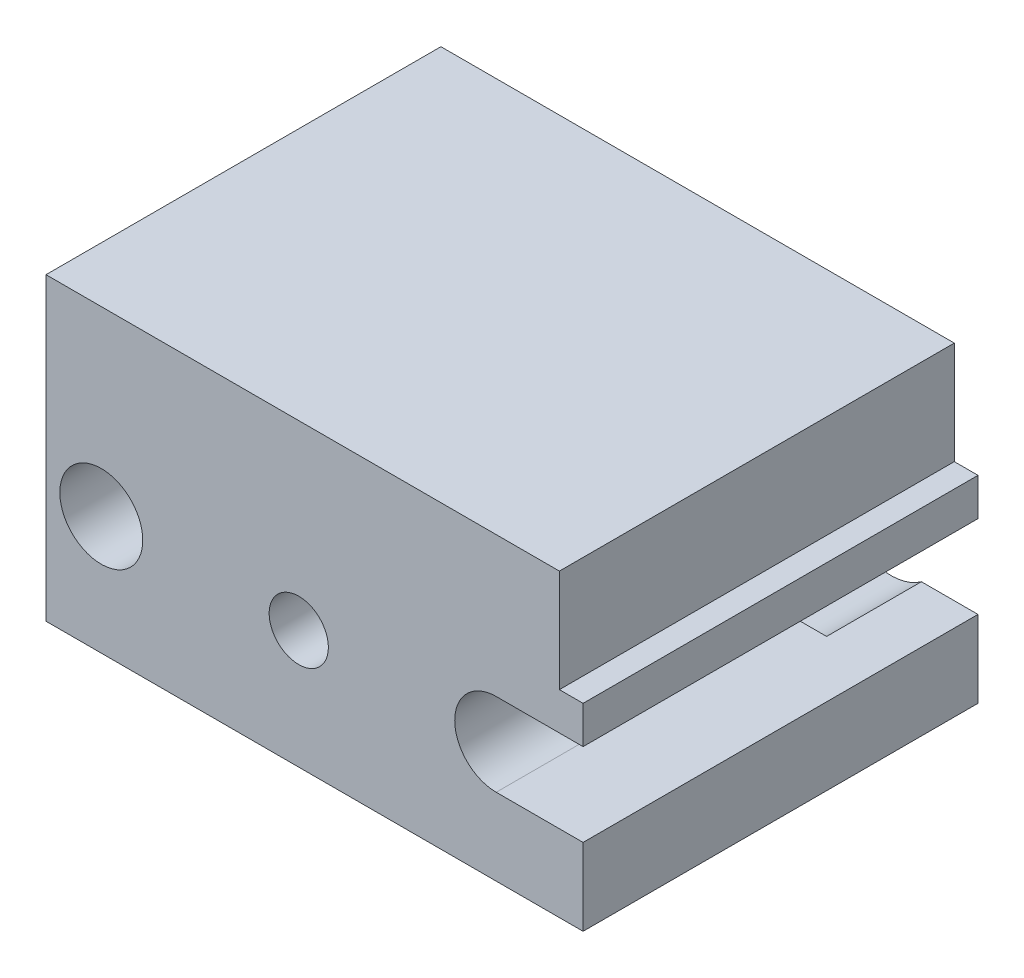
ISO-10303-21;
HEADER;
FILE_DESCRIPTION(('STEP AP214'),'2;1');
FILE_NAME('part.step','',(''),(''),'','','');
FILE_SCHEMA(('AUTOMOTIVE_DESIGN { 1 0 10303 214 1 1 1 1 }'));
ENDSEC;
DATA;
#1=APPLICATION_CONTEXT('core data for automotive mechanical design processes');
#2=APPLICATION_PROTOCOL_DEFINITION('international standard','automotive_design',2000,#1);
#3=PRODUCT_CONTEXT('',#1,'mechanical');
#4=PRODUCT('Part','Part','',(#3));
#5=PRODUCT_RELATED_PRODUCT_CATEGORY('part','',(#4));
#6=PRODUCT_DEFINITION_FORMATION('','',#4);
#7=PRODUCT_DEFINITION_CONTEXT('part definition',#1,'design');
#8=PRODUCT_DEFINITION('design','',#6,#7);
#9=PRODUCT_DEFINITION_SHAPE('','',#8);
#10=(LENGTH_UNIT() NAMED_UNIT(*) SI_UNIT(.MILLI.,.METRE.));
#11=(NAMED_UNIT(*) PLANE_ANGLE_UNIT() SI_UNIT($,.RADIAN.));
#12=(NAMED_UNIT(*) SI_UNIT($,.STERADIAN.) SOLID_ANGLE_UNIT());
#13=UNCERTAINTY_MEASURE_WITH_UNIT(LENGTH_MEASURE(1.E-05),#10,'distance_accuracy_value','');
#14=(GEOMETRIC_REPRESENTATION_CONTEXT(3) GLOBAL_UNCERTAINTY_ASSIGNED_CONTEXT((#13)) GLOBAL_UNIT_ASSIGNED_CONTEXT((#10,
#11,#12)) REPRESENTATION_CONTEXT('',''));
#15=CARTESIAN_POINT('',(0.,0.,0.));
#16=DIRECTION('',(0.,0.,1.));
#17=DIRECTION('',(1.,0.,0.));
#18=AXIS2_PLACEMENT_3D('',#15,#16,#17);
#19=CARTESIAN_POINT('',(0.,4.,0.));
#20=DIRECTION('',(0.,1.,0.));
#21=DIRECTION('',(0.,0.,1.));
#22=AXIS2_PLACEMENT_3D('',#19,#20,#21);
#23=PLANE('',#22);
#24=DIRECTION('',(1.,0.,0.));
#25=VECTOR('',#24,1.);
#26=CARTESIAN_POINT('',(0.,4.,5.));
#27=LINE('',#26,#25);
#28=CARTESIAN_POINT('',(0.,4.,5.));
#29=VERTEX_POINT('',#28);
#30=CARTESIAN_POINT('',(6.5,4.,5.));
#31=VERTEX_POINT('',#30);
#32=EDGE_CURVE('E213',#29,#31,#27,.T.);
#33=ORIENTED_EDGE('',*,*,#32,.T.);
#34=DIRECTION('',(0.,0.,1.));
#35=VECTOR('',#34,1.);
#36=CARTESIAN_POINT('',(6.5,4.,5.));
#37=LINE('',#36,#35);
#38=CARTESIAN_POINT('',(6.5,4.,0.));
#39=VERTEX_POINT('',#38);
#40=EDGE_CURVE('E145',#39,#31,#37,.T.);
#41=ORIENTED_EDGE('',*,*,#40,.F.);
#42=DIRECTION('',(-1.,0.,0.));
#43=VECTOR('',#42,1.);
#44=CARTESIAN_POINT('',(6.8,4.,0.));
#45=LINE('',#44,#43);
#46=CARTESIAN_POINT('',(0.,4.,0.));
#47=VERTEX_POINT('',#46);
#48=EDGE_CURVE('E208',#39,#47,#45,.T.);
#49=ORIENTED_EDGE('',*,*,#48,.T.);
#50=DIRECTION('',(0.,0.,1.));
#51=VECTOR('',#50,1.);
#52=CARTESIAN_POINT('',(0.,4.,0.));
#53=LINE('',#52,#51);
#54=EDGE_CURVE('E224',#47,#29,#53,.T.);
#55=ORIENTED_EDGE('',*,*,#54,.T.);
#56=EDGE_LOOP('',(#33,#41,#49,#55));
#57=FACE_BOUND('',#56,.T.);
#58=ADVANCED_FACE('F46',(#57),#23,.T.);
#59=CARTESIAN_POINT('',(6.8,0.2,0.));
#60=DIRECTION('',(0.,0.,-1.));
#61=DIRECTION('',(-1.,0.,0.));
#62=AXIS2_PLACEMENT_3D('',#59,#60,#61);
#63=PLANE('',#62);
#64=CARTESIAN_POINT('',(3.2,1.7,0.));
#65=DIRECTION('',(0.,0.,-1.));
#66=DIRECTION('',(-1.,0.,0.));
#67=AXIS2_PLACEMENT_3D('',#64,#65,#66);
#68=CIRCLE('',#67,0.374999999999999);
#69=CARTESIAN_POINT('',(2.825,1.7,0.));
#70=VERTEX_POINT('',#69);
#71=EDGE_CURVE('E255',#70,#70,#68,.T.);
#72=ORIENTED_EDGE('',*,*,#71,.F.);
#73=EDGE_LOOP('',(#72));
#74=FACE_BOUND('',#73,.T.);
#75=DIRECTION('',(1.,0.,0.));
#76=VECTOR('',#75,1.);
#77=CARTESIAN_POINT('',(6.5,2.7,0.));
#78=LINE('',#77,#76);
#79=CARTESIAN_POINT('',(6.5,2.7,0.));
#80=VERTEX_POINT('',#79);
#81=CARTESIAN_POINT('',(6.8,2.7,0.));
#82=VERTEX_POINT('',#81);
#83=EDGE_CURVE('E140',#80,#82,#78,.T.);
#84=ORIENTED_EDGE('',*,*,#83,.T.);
#85=DIRECTION('',(0.,1.,0.));
#86=VECTOR('',#85,1.);
#87=CARTESIAN_POINT('',(6.8,0.2,0.));
#88=LINE('',#87,#86);
#89=CARTESIAN_POINT('',(6.8,2.225,0.));
#90=VERTEX_POINT('',#89);
#91=EDGE_CURVE('E231',#90,#82,#88,.T.);
#92=ORIENTED_EDGE('',*,*,#91,.F.);
#93=DIRECTION('',(1.,0.,0.));
#94=VECTOR('',#93,1.);
#95=CARTESIAN_POINT('',(0.,2.225,0.));
#96=LINE('',#95,#94);
#97=CARTESIAN_POINT('',(6.08324274291892,2.225,0.));
#98=VERTEX_POINT('',#97);
#99=EDGE_CURVE('E163',#98,#90,#96,.T.);
#100=ORIENTED_EDGE('',*,*,#99,.F.);
#101=CARTESIAN_POINT('',(5.7,1.7,0.));
#102=DIRECTION('',(0.,0.,-1.));
#103=DIRECTION('',(-1.,0.,0.));
#104=AXIS2_PLACEMENT_3D('',#101,#102,#103);
#105=CIRCLE('',#104,0.650000000000015);
#106=CARTESIAN_POINT('',(6.08324274291892,1.175,0.));
#107=VERTEX_POINT('',#106);
#108=EDGE_CURVE('E184',#107,#98,#105,.T.);
#109=ORIENTED_EDGE('',*,*,#108,.F.);
#110=DIRECTION('',(1.,0.,0.));
#111=VECTOR('',#110,1.);
#112=CARTESIAN_POINT('',(0.,1.175,0.));
#113=LINE('',#112,#111);
#114=CARTESIAN_POINT('',(6.8,1.175,0.));
#115=VERTEX_POINT('',#114);
#116=EDGE_CURVE('E69',#107,#115,#113,.T.);
#117=ORIENTED_EDGE('',*,*,#116,.T.);
#118=CARTESIAN_POINT('',(6.8,0.2,0.));
#119=VERTEX_POINT('',#118);
#120=EDGE_CURVE('E228',#119,#115,#88,.T.);
#121=ORIENTED_EDGE('',*,*,#120,.F.);
#122=DIRECTION('',(-1.,0.,0.));
#123=VECTOR('',#122,1.);
#124=CARTESIAN_POINT('',(6.8,0.2,0.));
#125=LINE('',#124,#123);
#126=CARTESIAN_POINT('',(0.,0.2,0.));
#127=VERTEX_POINT('',#126);
#128=EDGE_CURVE('E209',#119,#127,#125,.T.);
#129=ORIENTED_EDGE('',*,*,#128,.T.);
#130=DIRECTION('',(0.,1.,0.));
#131=VECTOR('',#130,1.);
#132=CARTESIAN_POINT('',(0.,0.2,0.));
#133=LINE('',#132,#131);
#134=EDGE_CURVE('E222',#127,#47,#133,.T.);
#135=ORIENTED_EDGE('',*,*,#134,.T.);
#136=ORIENTED_EDGE('',*,*,#48,.F.);
#137=DIRECTION('',(0.,1.,0.));
#138=VECTOR('',#137,1.);
#139=CARTESIAN_POINT('',(6.5,4.,0.));
#140=LINE('',#139,#138);
#141=EDGE_CURVE('E61',#80,#39,#140,.T.);
#142=ORIENTED_EDGE('',*,*,#141,.F.);
#143=EDGE_LOOP('',(#84,#92,#100,#109,#117,#121,#129,#135,#136,#142));
#144=FACE_BOUND('',#143,.T.);
#145=CARTESIAN_POINT('',(0.700000000000001,1.7,0.));
#146=DIRECTION('',(0.,0.,-1.));
#147=DIRECTION('',(-1.,0.,0.));
#148=AXIS2_PLACEMENT_3D('',#145,#146,#147);
#149=CIRCLE('',#148,0.650000000000015);
#150=CARTESIAN_POINT('',(0.0499999999999854,1.7,0.));
#151=VERTEX_POINT('',#150);
#152=EDGE_CURVE('E196',#151,#151,#149,.T.);
#153=ORIENTED_EDGE('',*,*,#152,.F.);
#154=EDGE_LOOP('',(#153));
#155=FACE_BOUND('',#154,.T.);
#156=ADVANCED_FACE('F48',(#74,#144,#155),#63,.T.);
#157=CARTESIAN_POINT('',(6.8,0.2,5.));
#158=DIRECTION('',(1.,0.,0.));
#159=DIRECTION('',(0.,0.,-1.));
#160=AXIS2_PLACEMENT_3D('',#157,#158,#159);
#161=PLANE('',#160);
#162=DIRECTION('',(0.,0.,-1.));
#163=VECTOR('',#162,1.);
#164=CARTESIAN_POINT('',(6.8,2.7,5.));
#165=LINE('',#164,#163);
#166=CARTESIAN_POINT('',(6.8,2.7,5.));
#167=VERTEX_POINT('',#166);
#168=EDGE_CURVE('E149',#167,#82,#165,.T.);
#169=ORIENTED_EDGE('',*,*,#168,.F.);
#170=DIRECTION('',(0.,1.,0.));
#171=VECTOR('',#170,1.);
#172=CARTESIAN_POINT('',(6.8,0.2,5.));
#173=LINE('',#172,#171);
#174=CARTESIAN_POINT('',(6.8,2.225,5.));
#175=VERTEX_POINT('',#174);
#176=EDGE_CURVE('E156',#175,#167,#173,.T.);
#177=ORIENTED_EDGE('',*,*,#176,.F.);
#178=DIRECTION('',(0.,0.,1.));
#179=VECTOR('',#178,1.);
#180=CARTESIAN_POINT('',(6.8,2.225,0.));
#181=LINE('',#180,#179);
#182=EDGE_CURVE('E170',#90,#175,#181,.T.);
#183=ORIENTED_EDGE('',*,*,#182,.F.);
#184=ORIENTED_EDGE('',*,*,#91,.T.);
#185=EDGE_LOOP('',(#169,#177,#183,#184));
#186=FACE_BOUND('',#185,.T.);
#187=ADVANCED_FACE('F252',(#186),#161,.T.);
#188=CARTESIAN_POINT('',(0.,0.2,5.));
#189=DIRECTION('',(0.,0.,1.));
#190=DIRECTION('',(1.,0.,0.));
#191=AXIS2_PLACEMENT_3D('',#188,#189,#190);
#192=PLANE('',#191);
#193=CARTESIAN_POINT('',(3.2,1.7,5.));
#194=DIRECTION('',(0.,0.,1.));
#195=DIRECTION('',(1.,0.,0.));
#196=AXIS2_PLACEMENT_3D('',#193,#194,#195);
#197=CIRCLE('',#196,0.374999999999999);
#198=CARTESIAN_POINT('',(3.575,1.7,5.));
#199=VERTEX_POINT('',#198);
#200=EDGE_CURVE('E253',#199,#199,#197,.T.);
#201=ORIENTED_EDGE('',*,*,#200,.F.);
#202=EDGE_LOOP('',(#201));
#203=FACE_BOUND('',#202,.T.);
#204=DIRECTION('',(1.,0.,0.));
#205=VECTOR('',#204,1.);
#206=CARTESIAN_POINT('',(6.5,2.7,5.));
#207=LINE('',#206,#205);
#208=CARTESIAN_POINT('',(6.5,2.7,5.));
#209=VERTEX_POINT('',#208);
#210=EDGE_CURVE('E137',#209,#167,#207,.T.);
#211=ORIENTED_EDGE('',*,*,#210,.F.);
#212=DIRECTION('',(0.,-1.,0.));
#213=VECTOR('',#212,1.);
#214=CARTESIAN_POINT('',(6.5,4.,5.));
#215=LINE('',#214,#213);
#216=EDGE_CURVE('E141',#31,#209,#215,.T.);
#217=ORIENTED_EDGE('',*,*,#216,.F.);
#218=ORIENTED_EDGE('',*,*,#32,.F.);
#219=DIRECTION('',(0.,1.,0.));
#220=VECTOR('',#219,1.);
#221=CARTESIAN_POINT('',(0.,0.2,5.));
#222=LINE('',#221,#220);
#223=CARTESIAN_POINT('',(0.,0.2,5.));
#224=VERTEX_POINT('',#223);
#225=EDGE_CURVE('E235',#224,#29,#222,.T.);
#226=ORIENTED_EDGE('',*,*,#225,.F.);
#227=DIRECTION('',(1.,0.,0.));
#228=VECTOR('',#227,1.);
#229=CARTESIAN_POINT('',(0.,0.2,5.));
#230=LINE('',#229,#228);
#231=CARTESIAN_POINT('',(6.8,0.2,5.));
#232=VERTEX_POINT('',#231);
#233=EDGE_CURVE('E216',#224,#232,#230,.T.);
#234=ORIENTED_EDGE('',*,*,#233,.T.);
#235=CARTESIAN_POINT('',(6.8,1.175,5.));
#236=VERTEX_POINT('',#235);
#237=EDGE_CURVE('E232',#232,#236,#173,.T.);
#238=ORIENTED_EDGE('',*,*,#237,.T.);
#239=DIRECTION('',(1.,0.,0.));
#240=VECTOR('',#239,1.);
#241=CARTESIAN_POINT('',(0.,1.175,5.));
#242=LINE('',#241,#240);
#243=CARTESIAN_POINT('',(5.7,1.17499999999999,5.));
#244=VERTEX_POINT('',#243);
#245=EDGE_CURVE('E165',#244,#236,#242,.T.);
#246=ORIENTED_EDGE('',*,*,#245,.F.);
#247=CARTESIAN_POINT('',(5.7,1.7,5.));
#248=DIRECTION('',(0.,0.,-1.));
#249=DIRECTION('',(-1.,0.,0.));
#250=AXIS2_PLACEMENT_3D('',#247,#248,#249);
#251=CIRCLE('',#250,0.525000000000013);
#252=CARTESIAN_POINT('',(5.7,2.225,5.));
#253=VERTEX_POINT('',#252);
#254=EDGE_CURVE('E193',#244,#253,#251,.T.);
#255=ORIENTED_EDGE('',*,*,#254,.T.);
#256=DIRECTION('',(1.,0.,0.));
#257=VECTOR('',#256,1.);
#258=CARTESIAN_POINT('',(0.,2.225,5.));
#259=LINE('',#258,#257);
#260=EDGE_CURVE('E158',#253,#175,#259,.T.);
#261=ORIENTED_EDGE('',*,*,#260,.T.);
#262=ORIENTED_EDGE('',*,*,#176,.T.);
#263=EDGE_LOOP('',(#211,#217,#218,#226,#234,#238,#246,#255,#261,#262));
#264=FACE_BOUND('',#263,.T.);
#265=CARTESIAN_POINT('',(0.700000000000001,1.7,5.));
#266=DIRECTION('',(0.,0.,-1.));
#267=DIRECTION('',(-1.,0.,0.));
#268=AXIS2_PLACEMENT_3D('',#265,#266,#267);
#269=CIRCLE('',#268,0.525000000000013);
#270=CARTESIAN_POINT('',(0.174999999999988,1.7,5.));
#271=VERTEX_POINT('',#270);
#272=EDGE_CURVE('E205',#271,#271,#269,.T.);
#273=ORIENTED_EDGE('',*,*,#272,.T.);
#274=EDGE_LOOP('',(#273));
#275=FACE_BOUND('',#274,.T.);
#276=ADVANCED_FACE('F152',(#203,#264,#275),#192,.T.);
#277=CARTESIAN_POINT('',(6.22500000000001,1.7,1.2));
#278=DIRECTION('',(0.,0.,1.));
#279=DIRECTION('',(1.,0.,0.));
#280=AXIS2_PLACEMENT_3D('',#277,#278,#279);
#281=PLANE('',#280);
#282=DIRECTION('',(1.,0.,0.));
#283=VECTOR('',#282,1.);
#284=CARTESIAN_POINT('',(6.22500000000001,2.225,1.2));
#285=LINE('',#284,#283);
#286=CARTESIAN_POINT('',(5.7,2.225,1.2));
#287=VERTEX_POINT('',#286);
#288=CARTESIAN_POINT('',(6.08324274291892,2.225,1.2));
#289=VERTEX_POINT('',#288);
#290=EDGE_CURVE('E182',#287,#289,#285,.T.);
#291=ORIENTED_EDGE('',*,*,#290,.F.);
#292=CARTESIAN_POINT('',(5.7,1.7,1.2));
#293=DIRECTION('',(0.,0.,-1.));
#294=DIRECTION('',(-1.,0.,0.));
#295=AXIS2_PLACEMENT_3D('',#292,#293,#294);
#296=CIRCLE('',#295,0.525000000000013);
#297=CARTESIAN_POINT('',(5.7,1.17499999999999,1.2));
#298=VERTEX_POINT('',#297);
#299=EDGE_CURVE('E190',#298,#287,#296,.T.);
#300=ORIENTED_EDGE('',*,*,#299,.F.);
#301=DIRECTION('',(1.,0.,0.));
#302=VECTOR('',#301,1.);
#303=CARTESIAN_POINT('',(6.22500000000001,1.175,1.2));
#304=LINE('',#303,#302);
#305=CARTESIAN_POINT('',(6.08324274291892,1.175,1.2));
#306=VERTEX_POINT('',#305);
#307=EDGE_CURVE('E172',#298,#306,#304,.T.);
#308=ORIENTED_EDGE('',*,*,#307,.T.);
#309=CARTESIAN_POINT('',(5.7,1.7,1.2));
#310=DIRECTION('',(0.,0.,-1.));
#311=DIRECTION('',(-1.,0.,0.));
#312=AXIS2_PLACEMENT_3D('',#309,#310,#311);
#313=CIRCLE('',#312,0.650000000000015);
#314=EDGE_CURVE('E187',#306,#289,#313,.T.);
#315=ORIENTED_EDGE('',*,*,#314,.T.);
#316=EDGE_LOOP('',(#291,#300,#308,#315));
#317=FACE_BOUND('',#316,.T.);
#318=ADVANCED_FACE('F284',(#317),#281,.F.);
#319=CARTESIAN_POINT('',(5.7,1.7,0.));
#320=DIRECTION('',(0.,0.,-1.));
#321=DIRECTION('',(-1.,0.,0.));
#322=AXIS2_PLACEMENT_3D('',#319,#320,#321);
#323=CYLINDRICAL_SURFACE('',#322,0.650000000000015);
#324=DIRECTION('',(0.,0.,-1.));
#325=VECTOR('',#324,1.);
#326=CARTESIAN_POINT('',(6.08324274291892,2.225,0.));
#327=LINE('',#326,#325);
#328=EDGE_CURVE('E13',#289,#98,#327,.T.);
#329=ORIENTED_EDGE('',*,*,#328,.F.);
#330=ORIENTED_EDGE('',*,*,#314,.F.);
#331=DIRECTION('',(0.,0.,-1.));
#332=VECTOR('',#331,1.);
#333=CARTESIAN_POINT('',(6.08324274291892,1.175,0.));
#334=LINE('',#333,#332);
#335=EDGE_CURVE('E54',#306,#107,#334,.T.);
#336=ORIENTED_EDGE('',*,*,#335,.T.);
#337=ORIENTED_EDGE('',*,*,#108,.T.);
#338=EDGE_LOOP('',(#329,#330,#336,#337));
#339=FACE_BOUND('',#338,.T.);
#340=ADVANCED_FACE('F242',(#339),#323,.F.);
#341=DIRECTION('',(0.,0.,1.));
#342=VECTOR('',#341,1.);
#343=CARTESIAN_POINT('',(6.8,1.175,0.));
#344=LINE('',#343,#342);
#345=EDGE_CURVE('E173',#115,#236,#344,.T.);
#346=ORIENTED_EDGE('',*,*,#345,.T.);
#347=ORIENTED_EDGE('',*,*,#237,.F.);
#348=DIRECTION('',(0.,0.,-1.));
#349=VECTOR('',#348,1.);
#350=CARTESIAN_POINT('',(6.8,0.2,5.));
#351=LINE('',#350,#349);
#352=EDGE_CURVE('E219',#232,#119,#351,.T.);
#353=ORIENTED_EDGE('',*,*,#352,.T.);
#354=ORIENTED_EDGE('',*,*,#120,.T.);
#355=EDGE_LOOP('',(#346,#347,#353,#354));
#356=FACE_BOUND('',#355,.T.);
#357=ADVANCED_FACE('F271',(#356),#161,.T.);
#358=CARTESIAN_POINT('',(0.,0.2,0.));
#359=DIRECTION('',(-1.,0.,0.));
#360=DIRECTION('',(0.,0.,1.));
#361=AXIS2_PLACEMENT_3D('',#358,#359,#360);
#362=PLANE('',#361);
#363=ORIENTED_EDGE('',*,*,#54,.F.);
#364=ORIENTED_EDGE('',*,*,#134,.F.);
#365=DIRECTION('',(0.,0.,1.));
#366=VECTOR('',#365,1.);
#367=CARTESIAN_POINT('',(0.,0.2,0.));
#368=LINE('',#367,#366);
#369=EDGE_CURVE('E212',#127,#224,#368,.T.);
#370=ORIENTED_EDGE('',*,*,#369,.T.);
#371=ORIENTED_EDGE('',*,*,#225,.T.);
#372=EDGE_LOOP('',(#363,#364,#370,#371));
#373=FACE_BOUND('',#372,.T.);
#374=ADVANCED_FACE('F281',(#373),#362,.T.);
#375=CARTESIAN_POINT('',(0.,0.2,0.));
#376=DIRECTION('',(0.,1.,0.));
#377=DIRECTION('',(0.,0.,1.));
#378=AXIS2_PLACEMENT_3D('',#375,#376,#377);
#379=PLANE('',#378);
#380=ORIENTED_EDGE('',*,*,#128,.F.);
#381=ORIENTED_EDGE('',*,*,#352,.F.);
#382=ORIENTED_EDGE('',*,*,#233,.F.);
#383=ORIENTED_EDGE('',*,*,#369,.F.);
#384=EDGE_LOOP('',(#380,#381,#382,#383));
#385=FACE_BOUND('',#384,.T.);
#386=ADVANCED_FACE('F277',(#385),#379,.F.);
#387=CARTESIAN_POINT('',(0.700000000000001,1.7,0.));
#388=DIRECTION('',(0.,0.,-1.));
#389=DIRECTION('',(-1.,0.,0.));
#390=AXIS2_PLACEMENT_3D('',#387,#388,#389);
#391=CYLINDRICAL_SURFACE('',#390,0.525000000000013);
#392=ORIENTED_EDGE('',*,*,#272,.F.);
#393=EDGE_LOOP('',(#392));
#394=FACE_BOUND('',#393,.T.);
#395=CARTESIAN_POINT('',(0.700000000000001,1.7,1.2));
#396=DIRECTION('',(0.,0.,-1.));
#397=DIRECTION('',(-1.,0.,0.));
#398=AXIS2_PLACEMENT_3D('',#395,#396,#397);
#399=CIRCLE('',#398,0.525000000000013);
#400=CARTESIAN_POINT('',(0.174999999999987,1.7,1.2));
#401=VERTEX_POINT('',#400);
#402=EDGE_CURVE('E202',#401,#401,#399,.T.);
#403=ORIENTED_EDGE('',*,*,#402,.T.);
#404=EDGE_LOOP('',(#403));
#405=FACE_BOUND('',#404,.T.);
#406=ADVANCED_FACE('F291',(#394,#405),#391,.F.);
#407=CARTESIAN_POINT('',(1.22500000000001,1.7,1.2));
#408=DIRECTION('',(0.,0.,1.));
#409=DIRECTION('',(1.,0.,0.));
#410=AXIS2_PLACEMENT_3D('',#407,#408,#409);
#411=PLANE('',#410);
#412=ORIENTED_EDGE('',*,*,#402,.F.);
#413=EDGE_LOOP('',(#412));
#414=FACE_BOUND('',#413,.T.);
#415=CARTESIAN_POINT('',(0.700000000000001,1.7,1.2));
#416=DIRECTION('',(0.,0.,-1.));
#417=DIRECTION('',(-1.,0.,0.));
#418=AXIS2_PLACEMENT_3D('',#415,#416,#417);
#419=CIRCLE('',#418,0.650000000000015);
#420=CARTESIAN_POINT('',(0.0499999999999854,1.7,1.2));
#421=VERTEX_POINT('',#420);
#422=EDGE_CURVE('E199',#421,#421,#419,.T.);
#423=ORIENTED_EDGE('',*,*,#422,.T.);
#424=EDGE_LOOP('',(#423));
#425=FACE_BOUND('',#424,.T.);
#426=ADVANCED_FACE('F326',(#414,#425),#411,.F.);
#427=CARTESIAN_POINT('',(0.700000000000001,1.7,0.));
#428=DIRECTION('',(0.,0.,-1.));
#429=DIRECTION('',(-1.,0.,0.));
#430=AXIS2_PLACEMENT_3D('',#427,#428,#429);
#431=CYLINDRICAL_SURFACE('',#430,0.650000000000015);
#432=ORIENTED_EDGE('',*,*,#422,.F.);
#433=EDGE_LOOP('',(#432));
#434=FACE_BOUND('',#433,.T.);
#435=ORIENTED_EDGE('',*,*,#152,.T.);
#436=EDGE_LOOP('',(#435));
#437=FACE_BOUND('',#436,.T.);
#438=ADVANCED_FACE('F315',(#434,#437),#431,.F.);
#439=CARTESIAN_POINT('',(5.7,1.7,0.));
#440=DIRECTION('',(0.,0.,-1.));
#441=DIRECTION('',(-1.,0.,0.));
#442=AXIS2_PLACEMENT_3D('',#439,#440,#441);
#443=CYLINDRICAL_SURFACE('',#442,0.525000000000013);
#444=ORIENTED_EDGE('',*,*,#299,.T.);
#445=DIRECTION('',(0.,0.,1.));
#446=VECTOR('',#445,1.);
#447=CARTESIAN_POINT('',(5.7,2.225,0.));
#448=LINE('',#447,#446);
#449=EDGE_CURVE('E167',#287,#253,#448,.T.);
#450=ORIENTED_EDGE('',*,*,#449,.T.);
#451=ORIENTED_EDGE('',*,*,#254,.F.);
#452=DIRECTION('',(0.,0.,1.));
#453=VECTOR('',#452,1.);
#454=CARTESIAN_POINT('',(5.7,1.17499999999999,0.));
#455=LINE('',#454,#453);
#456=EDGE_CURVE('E176',#298,#244,#455,.T.);
#457=ORIENTED_EDGE('',*,*,#456,.F.);
#458=EDGE_LOOP('',(#444,#450,#451,#457));
#459=FACE_BOUND('',#458,.T.);
#460=ADVANCED_FACE('F303',(#459),#443,.F.);
#461=CARTESIAN_POINT('',(0.,1.175,0.));
#462=DIRECTION('',(0.,-1.,0.));
#463=DIRECTION('',(1.,0.,0.));
#464=AXIS2_PLACEMENT_3D('',#461,#462,#463);
#465=PLANE('',#464);
#466=ORIENTED_EDGE('',*,*,#456,.T.);
#467=ORIENTED_EDGE('',*,*,#245,.T.);
#468=ORIENTED_EDGE('',*,*,#345,.F.);
#469=ORIENTED_EDGE('',*,*,#116,.F.);
#470=ORIENTED_EDGE('',*,*,#335,.F.);
#471=ORIENTED_EDGE('',*,*,#307,.F.);
#472=EDGE_LOOP('',(#466,#467,#468,#469,#470,#471));
#473=FACE_BOUND('',#472,.T.);
#474=ADVANCED_FACE('F307',(#473),#465,.F.);
#475=CARTESIAN_POINT('',(0.,2.225,0.));
#476=DIRECTION('',(0.,-1.,0.));
#477=DIRECTION('',(0.,0.,-1.));
#478=AXIS2_PLACEMENT_3D('',#475,#476,#477);
#479=PLANE('',#478);
#480=ORIENTED_EDGE('',*,*,#290,.T.);
#481=ORIENTED_EDGE('',*,*,#328,.T.);
#482=ORIENTED_EDGE('',*,*,#99,.T.);
#483=ORIENTED_EDGE('',*,*,#182,.T.);
#484=ORIENTED_EDGE('',*,*,#260,.F.);
#485=ORIENTED_EDGE('',*,*,#449,.F.);
#486=EDGE_LOOP('',(#480,#481,#482,#483,#484,#485));
#487=FACE_BOUND('',#486,.T.);
#488=ADVANCED_FACE('F250',(#487),#479,.T.);
#489=CARTESIAN_POINT('',(6.5,2.7,5.));
#490=DIRECTION('',(0.,-1.,0.));
#491=DIRECTION('',(0.,0.,-1.));
#492=AXIS2_PLACEMENT_3D('',#489,#490,#491);
#493=PLANE('',#492);
#494=ORIENTED_EDGE('',*,*,#168,.T.);
#495=ORIENTED_EDGE('',*,*,#83,.F.);
#496=DIRECTION('',(0.,0.,-1.));
#497=VECTOR('',#496,1.);
#498=CARTESIAN_POINT('',(6.5,2.7,5.));
#499=LINE('',#498,#497);
#500=EDGE_CURVE('E133',#209,#80,#499,.T.);
#501=ORIENTED_EDGE('',*,*,#500,.F.);
#502=ORIENTED_EDGE('',*,*,#210,.T.);
#503=EDGE_LOOP('',(#494,#495,#501,#502));
#504=FACE_BOUND('',#503,.T.);
#505=ADVANCED_FACE('F135',(#504),#493,.F.);
#506=CARTESIAN_POINT('',(6.5,0.,0.));
#507=DIRECTION('',(1.,0.,0.));
#508=DIRECTION('',(0.,0.,-1.));
#509=AXIS2_PLACEMENT_3D('',#506,#507,#508);
#510=PLANE('',#509);
#511=ORIENTED_EDGE('',*,*,#216,.T.);
#512=ORIENTED_EDGE('',*,*,#500,.T.);
#513=ORIENTED_EDGE('',*,*,#141,.T.);
#514=ORIENTED_EDGE('',*,*,#40,.T.);
#515=EDGE_LOOP('',(#511,#512,#513,#514));
#516=FACE_BOUND('',#515,.T.);
#517=ADVANCED_FACE('F144',(#516),#510,.T.);
#518=CARTESIAN_POINT('',(3.2,1.7,0.));
#519=DIRECTION('',(0.,0.,-1.));
#520=DIRECTION('',(-1.,0.,0.));
#521=AXIS2_PLACEMENT_3D('',#518,#519,#520);
#522=CYLINDRICAL_SURFACE('',#521,0.374999999999999);
#523=ORIENTED_EDGE('',*,*,#71,.T.);
#524=EDGE_LOOP('',(#523));
#525=FACE_BOUND('',#524,.T.);
#526=ORIENTED_EDGE('',*,*,#200,.T.);
#527=EDGE_LOOP('',(#526));
#528=FACE_BOUND('',#527,.T.);
#529=ADVANCED_FACE('F262',(#525,#528),#522,.F.);
#530=CLOSED_SHELL('',(#58,#156,#187,#276,#318,#340,#357,#374,#386,#406,#426,#438,#460,#474,#488,
#505,#517,#529));
#531=MANIFOLD_SOLID_BREP('B2',#530);
#532=ADVANCED_BREP_SHAPE_REPRESENTATION('',(#18,#531),#14);
#533=SHAPE_DEFINITION_REPRESENTATION(#9,#532);
ENDSEC;
END-ISO-10303-21;
